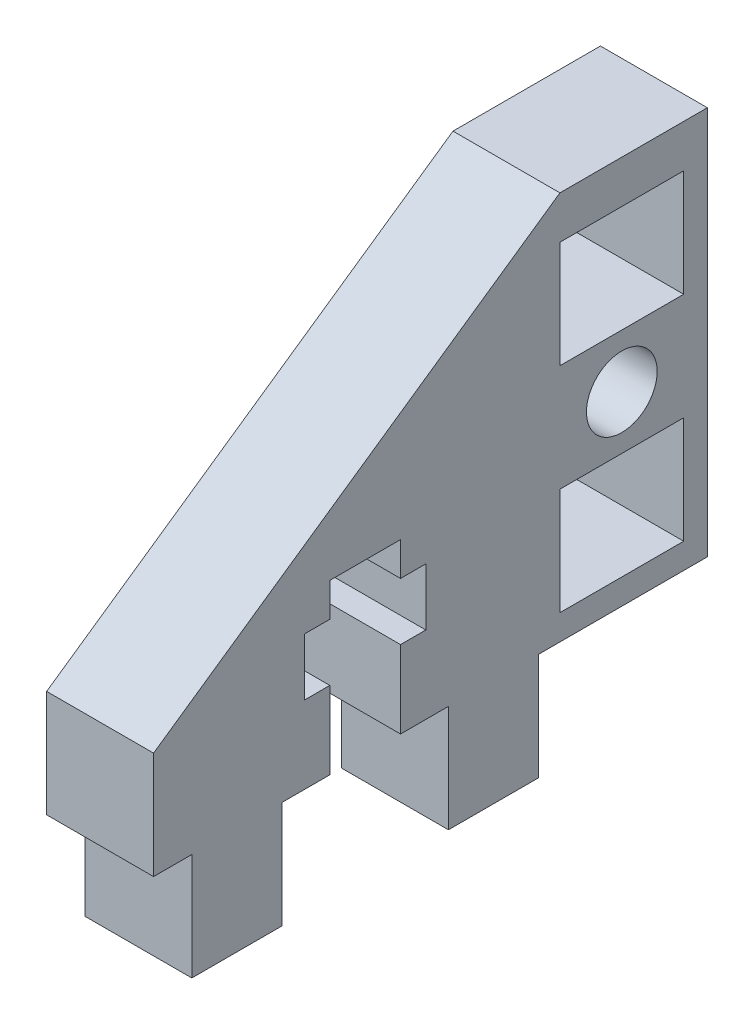
ISO-10303-21;
HEADER;
FILE_DESCRIPTION(('STEP AP214'),'2;1');
FILE_NAME('part.step','',(''),(''),'','','');
FILE_SCHEMA(('AUTOMOTIVE_DESIGN { 1 0 10303 214 1 1 1 1 }'));
ENDSEC;
DATA;
#1=APPLICATION_CONTEXT('core data for automotive mechanical design processes');
#2=APPLICATION_PROTOCOL_DEFINITION('international standard','automotive_design',2000,#1);
#3=PRODUCT_CONTEXT('',#1,'mechanical');
#4=PRODUCT('Part','Part','',(#3));
#5=PRODUCT_RELATED_PRODUCT_CATEGORY('part','',(#4));
#6=PRODUCT_DEFINITION_FORMATION('','',#4);
#7=PRODUCT_DEFINITION_CONTEXT('part definition',#1,'design');
#8=PRODUCT_DEFINITION('design','',#6,#7);
#9=PRODUCT_DEFINITION_SHAPE('','',#8);
#10=(LENGTH_UNIT() NAMED_UNIT(*) SI_UNIT(.MILLI.,.METRE.));
#11=(NAMED_UNIT(*) PLANE_ANGLE_UNIT() SI_UNIT($,.RADIAN.));
#12=(NAMED_UNIT(*) SI_UNIT($,.STERADIAN.) SOLID_ANGLE_UNIT());
#13=UNCERTAINTY_MEASURE_WITH_UNIT(LENGTH_MEASURE(1.E-05),#10,'distance_accuracy_value','');
#14=(GEOMETRIC_REPRESENTATION_CONTEXT(3) GLOBAL_UNCERTAINTY_ASSIGNED_CONTEXT((#13)) GLOBAL_UNIT_ASSIGNED_CONTEXT((#10,
#11,#12)) REPRESENTATION_CONTEXT('',''));
#15=CARTESIAN_POINT('',(0.,0.,0.));
#16=DIRECTION('',(0.,0.,1.));
#17=DIRECTION('',(1.,0.,0.));
#18=AXIS2_PLACEMENT_3D('',#15,#16,#17);
#19=CARTESIAN_POINT('',(265.43,16.5100000000001,77.895000039));
#20=DIRECTION('',(0.,0.,-1.));
#21=DIRECTION('',(-1.,0.,0.));
#22=AXIS2_PLACEMENT_3D('',#19,#20,#21);
#23=PLANE('',#22);
#24=DIRECTION('',(0.,1.,0.));
#25=VECTOR('',#24,1.);
#26=CARTESIAN_POINT('',(271.78,16.5100000000001,77.895000039));
#27=LINE('',#26,#25);
#28=CARTESIAN_POINT('',(271.78,16.5100000000001,77.895000039));
#29=VERTEX_POINT('',#28);
#30=CARTESIAN_POINT('',(271.78,22.8600000000001,77.895000039));
#31=VERTEX_POINT('',#30);
#32=EDGE_CURVE('E317',#29,#31,#27,.T.);
#33=ORIENTED_EDGE('',*,*,#32,.F.);
#34=DIRECTION('',(1.,0.,0.));
#35=VECTOR('',#34,1.);
#36=CARTESIAN_POINT('',(265.43,16.5100000000001,77.895000039));
#37=LINE('',#36,#35);
#38=CARTESIAN_POINT('',(265.43,16.5100000000001,77.895000039));
#39=VERTEX_POINT('',#38);
#40=EDGE_CURVE('E11',#39,#29,#37,.T.);
#41=ORIENTED_EDGE('',*,*,#40,.F.);
#42=DIRECTION('',(0.,1.,0.));
#43=VECTOR('',#42,1.);
#44=CARTESIAN_POINT('',(265.43,16.5100000000001,77.895000039));
#45=LINE('',#44,#43);
#46=CARTESIAN_POINT('',(265.43,22.8600000000001,77.895000039));
#47=VERTEX_POINT('',#46);
#48=EDGE_CURVE('E324',#39,#47,#45,.T.);
#49=ORIENTED_EDGE('',*,*,#48,.T.);
#50=DIRECTION('',(1.,0.,0.));
#51=VECTOR('',#50,1.);
#52=CARTESIAN_POINT('',(265.43,22.8600000000001,77.895000039));
#53=LINE('',#52,#51);
#54=EDGE_CURVE('E37',#47,#31,#53,.T.);
#55=ORIENTED_EDGE('',*,*,#54,.T.);
#56=EDGE_LOOP('',(#33,#41,#49,#55));
#57=FACE_BOUND('',#56,.T.);
#58=ADVANCED_FACE('F34',(#57),#23,.T.);
#59=CARTESIAN_POINT('',(265.43,16.5100000000001,77.895000039));
#60=DIRECTION('',(0.,-1.,0.));
#61=DIRECTION('',(0.,0.,-1.));
#62=AXIS2_PLACEMENT_3D('',#59,#60,#61);
#63=PLANE('',#62);
#64=DIRECTION('',(0.,0.,-1.));
#65=VECTOR('',#64,1.);
#66=CARTESIAN_POINT('',(271.78,16.5100000000001,77.895000039));
#67=LINE('',#66,#65);
#68=CARTESIAN_POINT('',(271.78,16.5100000000001,83.2450000070001));
#69=VERTEX_POINT('',#68);
#70=EDGE_CURVE('E328',#69,#29,#67,.T.);
#71=ORIENTED_EDGE('',*,*,#70,.F.);
#72=DIRECTION('',(1.,0.,0.));
#73=VECTOR('',#72,1.);
#74=CARTESIAN_POINT('',(265.43,16.5100000000001,83.2450000070001));
#75=LINE('',#74,#73);
#76=CARTESIAN_POINT('',(265.43,16.5100000000001,83.2450000070001));
#77=VERTEX_POINT('',#76);
#78=EDGE_CURVE('E42',#77,#69,#75,.T.);
#79=ORIENTED_EDGE('',*,*,#78,.F.);
#80=DIRECTION('',(0.,0.,-1.));
#81=VECTOR('',#80,1.);
#82=CARTESIAN_POINT('',(265.43,16.5100000000001,77.895000039));
#83=LINE('',#82,#81);
#84=EDGE_CURVE('E397',#77,#39,#83,.T.);
#85=ORIENTED_EDGE('',*,*,#84,.T.);
#86=ORIENTED_EDGE('',*,*,#40,.T.);
#87=EDGE_LOOP('',(#71,#79,#85,#86));
#88=FACE_BOUND('',#87,.T.);
#89=ADVANCED_FACE('F529',(#88),#63,.T.);
#90=CARTESIAN_POINT('',(265.43,22.8600000000001,83.2450000070001));
#91=DIRECTION('',(0.,0.,1.));
#92=DIRECTION('',(1.,0.,0.));
#93=AXIS2_PLACEMENT_3D('',#90,#91,#92);
#94=PLANE('',#93);
#95=DIRECTION('',(0.,-1.,0.));
#96=VECTOR('',#95,1.);
#97=CARTESIAN_POINT('',(271.78,22.8600000000001,83.2450000070001));
#98=LINE('',#97,#96);
#99=CARTESIAN_POINT('',(271.78,22.8600000000001,83.2450000070001));
#100=VERTEX_POINT('',#99);
#101=EDGE_CURVE('E468',#100,#69,#98,.T.);
#102=ORIENTED_EDGE('',*,*,#101,.F.);
#103=DIRECTION('',(1.,0.,0.));
#104=VECTOR('',#103,1.);
#105=CARTESIAN_POINT('',(265.43,22.8600000000001,83.2450000070001));
#106=LINE('',#105,#104);
#107=CARTESIAN_POINT('',(265.43,22.8600000000001,83.2450000070001));
#108=VERTEX_POINT('',#107);
#109=EDGE_CURVE('E474',#108,#100,#106,.T.);
#110=ORIENTED_EDGE('',*,*,#109,.F.);
#111=DIRECTION('',(0.,-1.,0.));
#112=VECTOR('',#111,1.);
#113=CARTESIAN_POINT('',(265.43,22.8600000000001,83.2450000070001));
#114=LINE('',#113,#112);
#115=EDGE_CURVE('E394',#108,#77,#114,.T.);
#116=ORIENTED_EDGE('',*,*,#115,.T.);
#117=ORIENTED_EDGE('',*,*,#78,.T.);
#118=EDGE_LOOP('',(#102,#110,#116,#117));
#119=FACE_BOUND('',#118,.T.);
#120=ADVANCED_FACE('F617',(#119),#94,.T.);
#121=CARTESIAN_POINT('',(265.43,22.8600000000001,86.090000032));
#122=DIRECTION('',(0.,-1.,0.));
#123=DIRECTION('',(0.,0.,-1.));
#124=AXIS2_PLACEMENT_3D('',#121,#122,#123);
#125=PLANE('',#124);
#126=DIRECTION('',(0.,0.,-1.));
#127=VECTOR('',#126,1.);
#128=CARTESIAN_POINT('',(271.78,22.8600000000001,86.090000032));
#129=LINE('',#128,#127);
#130=CARTESIAN_POINT('',(271.78,22.8600000000001,86.090000032));
#131=VERTEX_POINT('',#130);
#132=EDGE_CURVE('E465',#131,#100,#129,.T.);
#133=ORIENTED_EDGE('',*,*,#132,.F.);
#134=DIRECTION('',(1.,0.,0.));
#135=VECTOR('',#134,1.);
#136=CARTESIAN_POINT('',(265.43,22.8600000000001,86.090000032));
#137=LINE('',#136,#135);
#138=CARTESIAN_POINT('',(265.43,22.8600000000001,86.090000032));
#139=VERTEX_POINT('',#138);
#140=EDGE_CURVE('E476',#139,#131,#137,.T.);
#141=ORIENTED_EDGE('',*,*,#140,.F.);
#142=DIRECTION('',(0.,0.,-1.));
#143=VECTOR('',#142,1.);
#144=CARTESIAN_POINT('',(265.43,22.8600000000001,86.090000032));
#145=LINE('',#144,#143);
#146=EDGE_CURVE('E391',#139,#108,#145,.T.);
#147=ORIENTED_EDGE('',*,*,#146,.T.);
#148=ORIENTED_EDGE('',*,*,#109,.T.);
#149=EDGE_LOOP('',(#133,#141,#147,#148));
#150=FACE_BOUND('',#149,.T.);
#151=ADVANCED_FACE('F615',(#150),#125,.T.);
#152=CARTESIAN_POINT('',(265.43,22.8600000000001,86.090000032));
#153=DIRECTION('',(0.,0.,1.));
#154=DIRECTION('',(1.,0.,0.));
#155=AXIS2_PLACEMENT_3D('',#152,#153,#154);
#156=PLANE('',#155);
#157=DIRECTION('',(0.,-1.,0.));
#158=VECTOR('',#157,1.);
#159=CARTESIAN_POINT('',(271.78,22.8600000000001,86.090000032));
#160=LINE('',#159,#158);
#161=CARTESIAN_POINT('',(271.78,27.4599999440001,86.090000032));
#162=VERTEX_POINT('',#161);
#163=EDGE_CURVE('E462',#162,#131,#160,.T.);
#164=ORIENTED_EDGE('',*,*,#163,.F.);
#165=DIRECTION('',(1.,0.,0.));
#166=VECTOR('',#165,1.);
#167=CARTESIAN_POINT('',(265.43,27.4599999440001,86.090000032));
#168=LINE('',#167,#166);
#169=CARTESIAN_POINT('',(265.43,27.4599999440001,86.090000032));
#170=VERTEX_POINT('',#169);
#171=EDGE_CURVE('E478',#170,#162,#168,.T.);
#172=ORIENTED_EDGE('',*,*,#171,.F.);
#173=DIRECTION('',(0.,-1.,0.));
#174=VECTOR('',#173,1.);
#175=CARTESIAN_POINT('',(265.43,22.8600000000001,86.090000032));
#176=LINE('',#175,#174);
#177=EDGE_CURVE('E388',#170,#139,#176,.T.);
#178=ORIENTED_EDGE('',*,*,#177,.T.);
#179=ORIENTED_EDGE('',*,*,#140,.T.);
#180=EDGE_LOOP('',(#164,#172,#178,#179));
#181=FACE_BOUND('',#180,.T.);
#182=ADVANCED_FACE('F611',(#181),#156,.T.);
#183=CARTESIAN_POINT('',(265.43,27.4599999440001,86.090000032));
#184=DIRECTION('',(0.,1.,0.));
#185=DIRECTION('',(0.,0.,1.));
#186=AXIS2_PLACEMENT_3D('',#183,#184,#185);
#187=PLANE('',#186);
#188=DIRECTION('',(0.,0.,1.));
#189=VECTOR('',#188,1.);
#190=CARTESIAN_POINT('',(271.78,27.4599999440001,86.090000032));
#191=LINE('',#190,#189);
#192=CARTESIAN_POINT('',(271.78,27.4599999440001,84.589999984));
#193=VERTEX_POINT('',#192);
#194=EDGE_CURVE('E459',#193,#162,#191,.T.);
#195=ORIENTED_EDGE('',*,*,#194,.F.);
#196=DIRECTION('',(1.,0.,0.));
#197=VECTOR('',#196,1.);
#198=CARTESIAN_POINT('',(265.43,27.4599999440001,84.589999984));
#199=LINE('',#198,#197);
#200=CARTESIAN_POINT('',(265.43,27.4599999440001,84.589999984));
#201=VERTEX_POINT('',#200);
#202=EDGE_CURVE('E480',#201,#193,#199,.T.);
#203=ORIENTED_EDGE('',*,*,#202,.F.);
#204=DIRECTION('',(0.,0.,1.));
#205=VECTOR('',#204,1.);
#206=CARTESIAN_POINT('',(265.43,27.4599999440001,86.090000032));
#207=LINE('',#206,#205);
#208=EDGE_CURVE('E385',#201,#170,#207,.T.);
#209=ORIENTED_EDGE('',*,*,#208,.T.);
#210=ORIENTED_EDGE('',*,*,#171,.T.);
#211=EDGE_LOOP('',(#195,#203,#209,#210));
#212=FACE_BOUND('',#211,.T.);
#213=ADVANCED_FACE('F607',(#212),#187,.T.);
#214=CARTESIAN_POINT('',(265.43,27.4599999440001,84.589999984));
#215=DIRECTION('',(0.,0.,1.));
#216=DIRECTION('',(0.,-1.,0.));
#217=AXIS2_PLACEMENT_3D('',#214,#215,#216);
#218=PLANE('',#217);
#219=DIRECTION('',(0.,-1.,0.));
#220=VECTOR('',#219,1.);
#221=CARTESIAN_POINT('',(271.78,27.4599999440001,84.589999984));
#222=LINE('',#221,#220);
#223=CARTESIAN_POINT('',(271.78,30.8600000020001,84.589999984));
#224=VERTEX_POINT('',#223);
#225=EDGE_CURVE('E456',#224,#193,#222,.T.);
#226=ORIENTED_EDGE('',*,*,#225,.F.);
#227=DIRECTION('',(1.,0.,0.));
#228=VECTOR('',#227,1.);
#229=CARTESIAN_POINT('',(265.43,30.8600000020001,84.589999984));
#230=LINE('',#229,#228);
#231=CARTESIAN_POINT('',(265.43,30.8600000020001,84.589999984));
#232=VERTEX_POINT('',#231);
#233=EDGE_CURVE('E482',#232,#224,#230,.T.);
#234=ORIENTED_EDGE('',*,*,#233,.F.);
#235=DIRECTION('',(0.,-1.,0.));
#236=VECTOR('',#235,1.);
#237=CARTESIAN_POINT('',(265.43,27.4599999440001,84.589999984));
#238=LINE('',#237,#236);
#239=EDGE_CURVE('E382',#232,#201,#238,.T.);
#240=ORIENTED_EDGE('',*,*,#239,.T.);
#241=ORIENTED_EDGE('',*,*,#202,.T.);
#242=EDGE_LOOP('',(#226,#234,#240,#241));
#243=FACE_BOUND('',#242,.T.);
#244=ADVANCED_FACE('F603',(#243),#218,.T.);
#245=CARTESIAN_POINT('',(265.43,30.8600000020001,84.589999984));
#246=DIRECTION('',(0.,-1.,0.));
#247=DIRECTION('',(0.,0.,-1.));
#248=AXIS2_PLACEMENT_3D('',#245,#246,#247);
#249=PLANE('',#248);
#250=DIRECTION('',(0.,0.,-1.));
#251=VECTOR('',#250,1.);
#252=CARTESIAN_POINT('',(271.78,30.8600000020001,84.589999984));
#253=LINE('',#252,#251);
#254=CARTESIAN_POINT('',(271.78,30.8600000020001,86.090000032));
#255=VERTEX_POINT('',#254);
#256=EDGE_CURVE('E453',#255,#224,#253,.T.);
#257=ORIENTED_EDGE('',*,*,#256,.F.);
#258=DIRECTION('',(1.,0.,0.));
#259=VECTOR('',#258,1.);
#260=CARTESIAN_POINT('',(265.43,30.8600000020001,86.090000032));
#261=LINE('',#260,#259);
#262=CARTESIAN_POINT('',(265.43,30.8600000020001,86.090000032));
#263=VERTEX_POINT('',#262);
#264=EDGE_CURVE('E484',#263,#255,#261,.T.);
#265=ORIENTED_EDGE('',*,*,#264,.F.);
#266=DIRECTION('',(0.,0.,-1.));
#267=VECTOR('',#266,1.);
#268=CARTESIAN_POINT('',(265.43,30.8600000020001,84.589999984));
#269=LINE('',#268,#267);
#270=EDGE_CURVE('E379',#263,#232,#269,.T.);
#271=ORIENTED_EDGE('',*,*,#270,.T.);
#272=ORIENTED_EDGE('',*,*,#233,.T.);
#273=EDGE_LOOP('',(#257,#265,#271,#272));
#274=FACE_BOUND('',#273,.T.);
#275=ADVANCED_FACE('F599',(#274),#249,.T.);
#276=CARTESIAN_POINT('',(265.43,30.8600000020001,86.090000032));
#277=DIRECTION('',(0.,0.,1.));
#278=DIRECTION('',(1.,0.,0.));
#279=AXIS2_PLACEMENT_3D('',#276,#277,#278);
#280=PLANE('',#279);
#281=DIRECTION('',(0.,-1.,0.));
#282=VECTOR('',#281,1.);
#283=CARTESIAN_POINT('',(271.78,30.8600000020001,86.090000032));
#284=LINE('',#283,#282);
#285=CARTESIAN_POINT('',(271.78,32.8600000660001,86.090000032));
#286=VERTEX_POINT('',#285);
#287=EDGE_CURVE('E450',#286,#255,#284,.T.);
#288=ORIENTED_EDGE('',*,*,#287,.F.);
#289=DIRECTION('',(1.,0.,0.));
#290=VECTOR('',#289,1.);
#291=CARTESIAN_POINT('',(265.43,32.8600000660001,86.090000032));
#292=LINE('',#291,#290);
#293=CARTESIAN_POINT('',(265.43,32.8600000660001,86.090000032));
#294=VERTEX_POINT('',#293);
#295=EDGE_CURVE('E486',#294,#286,#292,.T.);
#296=ORIENTED_EDGE('',*,*,#295,.F.);
#297=DIRECTION('',(0.,-1.,0.));
#298=VECTOR('',#297,1.);
#299=CARTESIAN_POINT('',(265.43,30.8600000020001,86.090000032));
#300=LINE('',#299,#298);
#301=EDGE_CURVE('E376',#294,#263,#300,.T.);
#302=ORIENTED_EDGE('',*,*,#301,.T.);
#303=ORIENTED_EDGE('',*,*,#264,.T.);
#304=EDGE_LOOP('',(#288,#296,#302,#303));
#305=FACE_BOUND('',#304,.T.);
#306=ADVANCED_FACE('F595',(#305),#280,.T.);
#307=CARTESIAN_POINT('',(265.43,32.8600000660001,90.290000014));
#308=DIRECTION('',(0.,-1.,0.));
#309=DIRECTION('',(0.,0.,-1.));
#310=AXIS2_PLACEMENT_3D('',#307,#308,#309);
#311=PLANE('',#310);
#312=DIRECTION('',(0.,0.,-1.));
#313=VECTOR('',#312,1.);
#314=CARTESIAN_POINT('',(271.78,32.8600000660001,90.290000014));
#315=LINE('',#314,#313);
#316=CARTESIAN_POINT('',(271.78,32.8600000660001,90.290000014));
#317=VERTEX_POINT('',#316);
#318=EDGE_CURVE('E447',#317,#286,#315,.T.);
#319=ORIENTED_EDGE('',*,*,#318,.F.);
#320=DIRECTION('',(1.,0.,0.));
#321=VECTOR('',#320,1.);
#322=CARTESIAN_POINT('',(265.43,32.8600000660001,90.290000014));
#323=LINE('',#322,#321);
#324=CARTESIAN_POINT('',(265.43,32.8600000660001,90.290000014));
#325=VERTEX_POINT('',#324);
#326=EDGE_CURVE('E488',#325,#317,#323,.T.);
#327=ORIENTED_EDGE('',*,*,#326,.F.);
#328=DIRECTION('',(0.,0.,-1.));
#329=VECTOR('',#328,1.);
#330=CARTESIAN_POINT('',(265.43,32.8600000660001,90.290000014));
#331=LINE('',#330,#329);
#332=EDGE_CURVE('E373',#325,#294,#331,.T.);
#333=ORIENTED_EDGE('',*,*,#332,.T.);
#334=ORIENTED_EDGE('',*,*,#295,.T.);
#335=EDGE_LOOP('',(#319,#327,#333,#334));
#336=FACE_BOUND('',#335,.T.);
#337=ADVANCED_FACE('F591',(#336),#311,.T.);
#338=CARTESIAN_POINT('',(265.43,30.8600000020001,90.290000014));
#339=DIRECTION('',(0.,0.,-1.));
#340=DIRECTION('',(-1.,0.,0.));
#341=AXIS2_PLACEMENT_3D('',#338,#339,#340);
#342=PLANE('',#341);
#343=DIRECTION('',(0.,1.,0.));
#344=VECTOR('',#343,1.);
#345=CARTESIAN_POINT('',(271.78,30.8600000020001,90.290000014));
#346=LINE('',#345,#344);
#347=CARTESIAN_POINT('',(271.78,30.8600000020001,90.290000014));
#348=VERTEX_POINT('',#347);
#349=EDGE_CURVE('E444',#348,#317,#346,.T.);
#350=ORIENTED_EDGE('',*,*,#349,.F.);
#351=DIRECTION('',(1.,0.,0.));
#352=VECTOR('',#351,1.);
#353=CARTESIAN_POINT('',(265.43,30.8600000020001,90.290000014));
#354=LINE('',#353,#352);
#355=CARTESIAN_POINT('',(265.43,30.8600000020001,90.290000014));
#356=VERTEX_POINT('',#355);
#357=EDGE_CURVE('E490',#356,#348,#354,.T.);
#358=ORIENTED_EDGE('',*,*,#357,.F.);
#359=DIRECTION('',(0.,1.,0.));
#360=VECTOR('',#359,1.);
#361=CARTESIAN_POINT('',(265.43,30.8600000020001,90.290000014));
#362=LINE('',#361,#360);
#363=EDGE_CURVE('E370',#356,#325,#362,.T.);
#364=ORIENTED_EDGE('',*,*,#363,.T.);
#365=ORIENTED_EDGE('',*,*,#326,.T.);
#366=EDGE_LOOP('',(#350,#358,#364,#365));
#367=FACE_BOUND('',#366,.T.);
#368=ADVANCED_FACE('F587',(#367),#342,.T.);
#369=CARTESIAN_POINT('',(265.43,30.8600000020001,91.790000062));
#370=DIRECTION('',(0.,-1.,0.));
#371=DIRECTION('',(0.,0.,-1.));
#372=AXIS2_PLACEMENT_3D('',#369,#370,#371);
#373=PLANE('',#372);
#374=DIRECTION('',(0.,0.,-1.));
#375=VECTOR('',#374,1.);
#376=CARTESIAN_POINT('',(271.78,30.8600000020001,91.790000062));
#377=LINE('',#376,#375);
#378=CARTESIAN_POINT('',(271.78,30.8600000020001,91.790000062));
#379=VERTEX_POINT('',#378);
#380=EDGE_CURVE('E441',#379,#348,#377,.T.);
#381=ORIENTED_EDGE('',*,*,#380,.F.);
#382=DIRECTION('',(1.,0.,0.));
#383=VECTOR('',#382,1.);
#384=CARTESIAN_POINT('',(265.43,30.8600000020001,91.790000062));
#385=LINE('',#384,#383);
#386=CARTESIAN_POINT('',(265.43,30.8600000020001,91.790000062));
#387=VERTEX_POINT('',#386);
#388=EDGE_CURVE('E492',#387,#379,#385,.T.);
#389=ORIENTED_EDGE('',*,*,#388,.F.);
#390=DIRECTION('',(0.,0.,-1.));
#391=VECTOR('',#390,1.);
#392=CARTESIAN_POINT('',(265.43,30.8600000020001,91.790000062));
#393=LINE('',#392,#391);
#394=EDGE_CURVE('E367',#387,#356,#393,.T.);
#395=ORIENTED_EDGE('',*,*,#394,.T.);
#396=ORIENTED_EDGE('',*,*,#357,.T.);
#397=EDGE_LOOP('',(#381,#389,#395,#396));
#398=FACE_BOUND('',#397,.T.);
#399=ADVANCED_FACE('F583',(#398),#373,.T.);
#400=CARTESIAN_POINT('',(265.43,27.4599999440001,91.790000062));
#401=DIRECTION('',(0.,0.,-1.));
#402=DIRECTION('',(0.,1.,0.));
#403=AXIS2_PLACEMENT_3D('',#400,#401,#402);
#404=PLANE('',#403);
#405=DIRECTION('',(0.,1.,0.));
#406=VECTOR('',#405,1.);
#407=CARTESIAN_POINT('',(271.78,27.4599999440001,91.790000062));
#408=LINE('',#407,#406);
#409=CARTESIAN_POINT('',(271.78,27.4599999440001,91.790000062));
#410=VERTEX_POINT('',#409);
#411=EDGE_CURVE('E438',#410,#379,#408,.T.);
#412=ORIENTED_EDGE('',*,*,#411,.F.);
#413=DIRECTION('',(1.,0.,0.));
#414=VECTOR('',#413,1.);
#415=CARTESIAN_POINT('',(265.43,27.4599999440001,91.790000062));
#416=LINE('',#415,#414);
#417=CARTESIAN_POINT('',(265.43,27.4599999440001,91.790000062));
#418=VERTEX_POINT('',#417);
#419=EDGE_CURVE('E494',#418,#410,#416,.T.);
#420=ORIENTED_EDGE('',*,*,#419,.F.);
#421=DIRECTION('',(0.,1.,0.));
#422=VECTOR('',#421,1.);
#423=CARTESIAN_POINT('',(265.43,27.4599999440001,91.790000062));
#424=LINE('',#423,#422);
#425=EDGE_CURVE('E364',#418,#387,#424,.T.);
#426=ORIENTED_EDGE('',*,*,#425,.T.);
#427=ORIENTED_EDGE('',*,*,#388,.T.);
#428=EDGE_LOOP('',(#412,#420,#426,#427));
#429=FACE_BOUND('',#428,.T.);
#430=ADVANCED_FACE('F579',(#429),#404,.T.);
#431=CARTESIAN_POINT('',(265.43,27.4599999440001,90.290000014));
#432=DIRECTION('',(0.,1.,0.));
#433=DIRECTION('',(0.,0.,1.));
#434=AXIS2_PLACEMENT_3D('',#431,#432,#433);
#435=PLANE('',#434);
#436=DIRECTION('',(0.,0.,1.));
#437=VECTOR('',#436,1.);
#438=CARTESIAN_POINT('',(271.78,27.4599999440001,90.290000014));
#439=LINE('',#438,#437);
#440=CARTESIAN_POINT('',(271.78,27.4599999440001,90.290000014));
#441=VERTEX_POINT('',#440);
#442=EDGE_CURVE('E435',#441,#410,#439,.T.);
#443=ORIENTED_EDGE('',*,*,#442,.F.);
#444=DIRECTION('',(1.,0.,0.));
#445=VECTOR('',#444,1.);
#446=CARTESIAN_POINT('',(265.43,27.4599999440001,90.290000014));
#447=LINE('',#446,#445);
#448=CARTESIAN_POINT('',(265.43,27.4599999440001,90.290000014));
#449=VERTEX_POINT('',#448);
#450=EDGE_CURVE('E496',#449,#441,#447,.T.);
#451=ORIENTED_EDGE('',*,*,#450,.F.);
#452=DIRECTION('',(0.,0.,1.));
#453=VECTOR('',#452,1.);
#454=CARTESIAN_POINT('',(265.43,27.4599999440001,90.290000014));
#455=LINE('',#454,#453);
#456=EDGE_CURVE('E361',#449,#418,#455,.T.);
#457=ORIENTED_EDGE('',*,*,#456,.T.);
#458=ORIENTED_EDGE('',*,*,#419,.T.);
#459=EDGE_LOOP('',(#443,#451,#457,#458));
#460=FACE_BOUND('',#459,.T.);
#461=ADVANCED_FACE('F575',(#460),#435,.T.);
#462=CARTESIAN_POINT('',(265.43,22.8600000000001,90.290000014));
#463=DIRECTION('',(0.,0.,-1.));
#464=DIRECTION('',(-1.,0.,0.));
#465=AXIS2_PLACEMENT_3D('',#462,#463,#464);
#466=PLANE('',#465);
#467=DIRECTION('',(0.,1.,0.));
#468=VECTOR('',#467,1.);
#469=CARTESIAN_POINT('',(271.78,22.8600000000001,90.290000014));
#470=LINE('',#469,#468);
#471=CARTESIAN_POINT('',(271.78,22.8600000000001,90.290000014));
#472=VERTEX_POINT('',#471);
#473=EDGE_CURVE('E432',#472,#441,#470,.T.);
#474=ORIENTED_EDGE('',*,*,#473,.F.);
#475=DIRECTION('',(1.,0.,0.));
#476=VECTOR('',#475,1.);
#477=CARTESIAN_POINT('',(265.43,22.8600000000001,90.290000014));
#478=LINE('',#477,#476);
#479=CARTESIAN_POINT('',(265.43,22.8600000000001,90.290000014));
#480=VERTEX_POINT('',#479);
#481=EDGE_CURVE('E498',#480,#472,#478,.T.);
#482=ORIENTED_EDGE('',*,*,#481,.F.);
#483=DIRECTION('',(0.,1.,0.));
#484=VECTOR('',#483,1.);
#485=CARTESIAN_POINT('',(265.43,22.8600000000001,90.290000014));
#486=LINE('',#485,#484);
#487=EDGE_CURVE('E358',#480,#449,#486,.T.);
#488=ORIENTED_EDGE('',*,*,#487,.T.);
#489=ORIENTED_EDGE('',*,*,#450,.T.);
#490=EDGE_LOOP('',(#474,#482,#488,#489));
#491=FACE_BOUND('',#490,.T.);
#492=ADVANCED_FACE('F571',(#491),#466,.T.);
#493=CARTESIAN_POINT('',(265.43,22.8600000000001,93.135000039));
#494=DIRECTION('',(0.,-1.,0.));
#495=DIRECTION('',(0.,0.,-1.));
#496=AXIS2_PLACEMENT_3D('',#493,#494,#495);
#497=PLANE('',#496);
#498=DIRECTION('',(0.,0.,-1.));
#499=VECTOR('',#498,1.);
#500=CARTESIAN_POINT('',(271.78,22.8600000000001,93.135000039));
#501=LINE('',#500,#499);
#502=CARTESIAN_POINT('',(271.78,22.8600000000001,93.135000039));
#503=VERTEX_POINT('',#502);
#504=EDGE_CURVE('E429',#503,#472,#501,.T.);
#505=ORIENTED_EDGE('',*,*,#504,.F.);
#506=DIRECTION('',(1.,0.,0.));
#507=VECTOR('',#506,1.);
#508=CARTESIAN_POINT('',(265.43,22.8600000000001,93.135000039));
#509=LINE('',#508,#507);
#510=CARTESIAN_POINT('',(265.43,22.8600000000001,93.135000039));
#511=VERTEX_POINT('',#510);
#512=EDGE_CURVE('E500',#511,#503,#509,.T.);
#513=ORIENTED_EDGE('',*,*,#512,.F.);
#514=DIRECTION('',(0.,0.,-1.));
#515=VECTOR('',#514,1.);
#516=CARTESIAN_POINT('',(265.43,22.8600000000001,93.135000039));
#517=LINE('',#516,#515);
#518=EDGE_CURVE('E355',#511,#480,#517,.T.);
#519=ORIENTED_EDGE('',*,*,#518,.T.);
#520=ORIENTED_EDGE('',*,*,#481,.T.);
#521=EDGE_LOOP('',(#505,#513,#519,#520));
#522=FACE_BOUND('',#521,.T.);
#523=ADVANCED_FACE('F567',(#522),#497,.T.);
#524=CARTESIAN_POINT('',(265.43,16.5100000000001,93.135000039));
#525=DIRECTION('',(0.,0.,-1.));
#526=DIRECTION('',(-1.,0.,0.));
#527=AXIS2_PLACEMENT_3D('',#524,#525,#526);
#528=PLANE('',#527);
#529=DIRECTION('',(0.,1.,0.));
#530=VECTOR('',#529,1.);
#531=CARTESIAN_POINT('',(271.78,16.5100000000001,93.135000039));
#532=LINE('',#531,#530);
#533=CARTESIAN_POINT('',(271.78,16.5100000000001,93.135000039));
#534=VERTEX_POINT('',#533);
#535=EDGE_CURVE('E426',#534,#503,#532,.T.);
#536=ORIENTED_EDGE('',*,*,#535,.F.);
#537=DIRECTION('',(1.,0.,0.));
#538=VECTOR('',#537,1.);
#539=CARTESIAN_POINT('',(265.43,16.5100000000001,93.135000039));
#540=LINE('',#539,#538);
#541=CARTESIAN_POINT('',(265.43,16.5100000000001,93.135000039));
#542=VERTEX_POINT('',#541);
#543=EDGE_CURVE('E502',#542,#534,#540,.T.);
#544=ORIENTED_EDGE('',*,*,#543,.F.);
#545=DIRECTION('',(0.,1.,0.));
#546=VECTOR('',#545,1.);
#547=CARTESIAN_POINT('',(265.43,16.5100000000001,93.135000039));
#548=LINE('',#547,#546);
#549=EDGE_CURVE('E352',#542,#511,#548,.T.);
#550=ORIENTED_EDGE('',*,*,#549,.T.);
#551=ORIENTED_EDGE('',*,*,#512,.T.);
#552=EDGE_LOOP('',(#536,#544,#550,#551));
#553=FACE_BOUND('',#552,.T.);
#554=ADVANCED_FACE('F563',(#553),#528,.T.);
#555=CARTESIAN_POINT('',(265.43,16.5100000000001,93.135000039));
#556=DIRECTION('',(0.,-1.,0.));
#557=DIRECTION('',(0.,0.,-1.));
#558=AXIS2_PLACEMENT_3D('',#555,#556,#557);
#559=PLANE('',#558);
#560=DIRECTION('',(0.,0.,-1.));
#561=VECTOR('',#560,1.);
#562=CARTESIAN_POINT('',(271.78,16.5100000000001,93.135000039));
#563=LINE('',#562,#561);
#564=CARTESIAN_POINT('',(271.78,16.5100000000001,98.485000007));
#565=VERTEX_POINT('',#564);
#566=EDGE_CURVE('E423',#565,#534,#563,.T.);
#567=ORIENTED_EDGE('',*,*,#566,.F.);
#568=DIRECTION('',(1.,0.,0.));
#569=VECTOR('',#568,1.);
#570=CARTESIAN_POINT('',(265.43,16.5100000000001,98.485000007));
#571=LINE('',#570,#569);
#572=CARTESIAN_POINT('',(265.43,16.5100000000001,98.485000007));
#573=VERTEX_POINT('',#572);
#574=EDGE_CURVE('E504',#573,#565,#571,.T.);
#575=ORIENTED_EDGE('',*,*,#574,.F.);
#576=DIRECTION('',(0.,0.,-1.));
#577=VECTOR('',#576,1.);
#578=CARTESIAN_POINT('',(265.43,16.5100000000001,93.135000039));
#579=LINE('',#578,#577);
#580=EDGE_CURVE('E349',#573,#542,#579,.T.);
#581=ORIENTED_EDGE('',*,*,#580,.T.);
#582=ORIENTED_EDGE('',*,*,#543,.T.);
#583=EDGE_LOOP('',(#567,#575,#581,#582));
#584=FACE_BOUND('',#583,.T.);
#585=ADVANCED_FACE('F559',(#584),#559,.T.);
#586=CARTESIAN_POINT('',(265.43,16.5100000000001,98.485000007));
#587=DIRECTION('',(0.,0.,1.));
#588=DIRECTION('',(1.,0.,0.));
#589=AXIS2_PLACEMENT_3D('',#586,#587,#588);
#590=PLANE('',#589);
#591=DIRECTION('',(0.,-1.,0.));
#592=VECTOR('',#591,1.);
#593=CARTESIAN_POINT('',(271.78,16.5100000000001,98.485000007));
#594=LINE('',#593,#592);
#595=CARTESIAN_POINT('',(271.78,22.8600000000001,98.485000007));
#596=VERTEX_POINT('',#595);
#597=EDGE_CURVE('E420',#596,#565,#594,.T.);
#598=ORIENTED_EDGE('',*,*,#597,.F.);
#599=DIRECTION('',(1.,0.,0.));
#600=VECTOR('',#599,1.);
#601=CARTESIAN_POINT('',(265.43,22.8600000000001,98.485000007));
#602=LINE('',#601,#600);
#603=CARTESIAN_POINT('',(265.43,22.8600000000001,98.485000007));
#604=VERTEX_POINT('',#603);
#605=EDGE_CURVE('E506',#604,#596,#602,.T.);
#606=ORIENTED_EDGE('',*,*,#605,.F.);
#607=DIRECTION('',(0.,-1.,0.));
#608=VECTOR('',#607,1.);
#609=CARTESIAN_POINT('',(265.43,16.5100000000001,98.485000007));
#610=LINE('',#609,#608);
#611=EDGE_CURVE('E346',#604,#573,#610,.T.);
#612=ORIENTED_EDGE('',*,*,#611,.T.);
#613=ORIENTED_EDGE('',*,*,#574,.T.);
#614=EDGE_LOOP('',(#598,#606,#612,#613));
#615=FACE_BOUND('',#614,.T.);
#616=ADVANCED_FACE('F555',(#615),#590,.T.);
#617=CARTESIAN_POINT('',(265.43,22.8600000000001,98.485000007));
#618=DIRECTION('',(0.,-1.,0.));
#619=DIRECTION('',(0.,0.,-1.));
#620=AXIS2_PLACEMENT_3D('',#617,#618,#619);
#621=PLANE('',#620);
#622=DIRECTION('',(0.,0.,-1.));
#623=VECTOR('',#622,1.);
#624=CARTESIAN_POINT('',(271.78,22.8600000000001,98.485000007));
#625=LINE('',#624,#623);
#626=CARTESIAN_POINT('',(271.78,22.8600000000002,100.755000039));
#627=VERTEX_POINT('',#626);
#628=EDGE_CURVE('E417',#627,#596,#625,.T.);
#629=ORIENTED_EDGE('',*,*,#628,.F.);
#630=DIRECTION('',(1.,0.,0.));
#631=VECTOR('',#630,1.);
#632=CARTESIAN_POINT('',(265.43,22.8600000000002,100.755000039));
#633=LINE('',#632,#631);
#634=CARTESIAN_POINT('',(265.43,22.8600000000002,100.755000039));
#635=VERTEX_POINT('',#634);
#636=EDGE_CURVE('E508',#635,#627,#633,.T.);
#637=ORIENTED_EDGE('',*,*,#636,.F.);
#638=DIRECTION('',(0.,0.,-1.));
#639=VECTOR('',#638,1.);
#640=CARTESIAN_POINT('',(265.43,22.8600000000001,98.485000007));
#641=LINE('',#640,#639);
#642=EDGE_CURVE('E343',#635,#604,#641,.T.);
#643=ORIENTED_EDGE('',*,*,#642,.T.);
#644=ORIENTED_EDGE('',*,*,#605,.T.);
#645=EDGE_LOOP('',(#629,#637,#643,#644));
#646=FACE_BOUND('',#645,.T.);
#647=ADVANCED_FACE('F551',(#646),#621,.T.);
#648=CARTESIAN_POINT('',(265.43,29.2100000000002,100.755000039));
#649=DIRECTION('',(0.,0.,1.));
#650=DIRECTION('',(1.,0.,0.));
#651=AXIS2_PLACEMENT_3D('',#648,#649,#650);
#652=PLANE('',#651);
#653=DIRECTION('',(0.,-1.,0.));
#654=VECTOR('',#653,1.);
#655=CARTESIAN_POINT('',(271.78,29.2100000000002,100.755000039));
#656=LINE('',#655,#654);
#657=CARTESIAN_POINT('',(271.78,29.2100000000002,100.755000039));
#658=VERTEX_POINT('',#657);
#659=EDGE_CURVE('E414',#658,#627,#656,.T.);
#660=ORIENTED_EDGE('',*,*,#659,.F.);
#661=DIRECTION('',(1.,0.,0.));
#662=VECTOR('',#661,1.);
#663=CARTESIAN_POINT('',(265.43,29.2100000000002,100.755000039));
#664=LINE('',#663,#662);
#665=CARTESIAN_POINT('',(265.43,29.2100000000002,100.755000039));
#666=VERTEX_POINT('',#665);
#667=EDGE_CURVE('E510',#666,#658,#664,.T.);
#668=ORIENTED_EDGE('',*,*,#667,.F.);
#669=DIRECTION('',(0.,-1.,0.));
#670=VECTOR('',#669,1.);
#671=CARTESIAN_POINT('',(265.43,29.2100000000002,100.755000039));
#672=LINE('',#671,#670);
#673=EDGE_CURVE('E340',#666,#635,#672,.T.);
#674=ORIENTED_EDGE('',*,*,#673,.T.);
#675=ORIENTED_EDGE('',*,*,#636,.T.);
#676=EDGE_LOOP('',(#660,#668,#674,#675));
#677=FACE_BOUND('',#676,.T.);
#678=ADVANCED_FACE('F547',(#677),#652,.T.);
#679=CARTESIAN_POINT('',(265.43,45.9580000320001,76.6250000390001));
#680=DIRECTION('',(0.,0.82151260709376,0.57019035101097));
#681=DIRECTION('',(0.,-0.57019035101097,0.82151260709376));
#682=AXIS2_PLACEMENT_3D('',#679,#680,#681);
#683=PLANE('',#682);
#684=DIRECTION('',(0.,-0.57019035101097,0.82151260709376));
#685=VECTOR('',#684,1.);
#686=CARTESIAN_POINT('',(271.78,45.9580000320001,76.6250000390001));
#687=LINE('',#686,#685);
#688=CARTESIAN_POINT('',(271.78,45.9580000320001,76.6250000390001));
#689=VERTEX_POINT('',#688);
#690=EDGE_CURVE('E411',#689,#658,#687,.T.);
#691=ORIENTED_EDGE('',*,*,#690,.F.);
#692=DIRECTION('',(1.,0.,0.));
#693=VECTOR('',#692,1.);
#694=CARTESIAN_POINT('',(265.43,45.9580000320001,76.6250000390001));
#695=LINE('',#694,#693);
#696=CARTESIAN_POINT('',(265.43,45.9580000320001,76.6250000390001));
#697=VERTEX_POINT('',#696);
#698=EDGE_CURVE('E512',#697,#689,#695,.T.);
#699=ORIENTED_EDGE('',*,*,#698,.F.);
#700=DIRECTION('',(0.,-0.57019035101097,0.82151260709376));
#701=VECTOR('',#700,1.);
#702=CARTESIAN_POINT('',(265.43,45.9580000320001,76.6250000390001));
#703=LINE('',#702,#701);
#704=EDGE_CURVE('E337',#697,#666,#703,.T.);
#705=ORIENTED_EDGE('',*,*,#704,.T.);
#706=ORIENTED_EDGE('',*,*,#667,.T.);
#707=EDGE_LOOP('',(#691,#699,#705,#706));
#708=FACE_BOUND('',#707,.T.);
#709=ADVANCED_FACE('F543',(#708),#683,.T.);
#710=CARTESIAN_POINT('',(265.43,45.9580000320001,76.6250000390001));
#711=DIRECTION('',(0.,1.,0.));
#712=DIRECTION('',(0.,0.,1.));
#713=AXIS2_PLACEMENT_3D('',#710,#711,#712);
#714=PLANE('',#713);
#715=DIRECTION('',(0.,0.,1.));
#716=VECTOR('',#715,1.);
#717=CARTESIAN_POINT('',(271.78,45.9580000320001,76.6250000390001));
#718=LINE('',#717,#716);
#719=CARTESIAN_POINT('',(271.78,45.9580000320001,67.8700000230001));
#720=VERTEX_POINT('',#719);
#721=EDGE_CURVE('E408',#720,#689,#718,.T.);
#722=ORIENTED_EDGE('',*,*,#721,.F.);
#723=DIRECTION('',(1.,0.,0.));
#724=VECTOR('',#723,1.);
#725=CARTESIAN_POINT('',(265.43,45.9580000320001,67.8700000230001));
#726=LINE('',#725,#724);
#727=CARTESIAN_POINT('',(265.43,45.9580000320001,67.8700000230001));
#728=VERTEX_POINT('',#727);
#729=EDGE_CURVE('E514',#728,#720,#726,.T.);
#730=ORIENTED_EDGE('',*,*,#729,.F.);
#731=DIRECTION('',(0.,0.,1.));
#732=VECTOR('',#731,1.);
#733=CARTESIAN_POINT('',(265.43,45.9580000320001,76.6250000390001));
#734=LINE('',#733,#732);
#735=EDGE_CURVE('E334',#728,#697,#734,.T.);
#736=ORIENTED_EDGE('',*,*,#735,.T.);
#737=ORIENTED_EDGE('',*,*,#698,.T.);
#738=EDGE_LOOP('',(#722,#730,#736,#737));
#739=FACE_BOUND('',#738,.T.);
#740=ADVANCED_FACE('F541',(#739),#714,.T.);
#741=CARTESIAN_POINT('',(265.43,22.8600000000001,67.8700000230001));
#742=DIRECTION('',(0.,0.,-1.));
#743=DIRECTION('',(-1.,0.,0.));
#744=AXIS2_PLACEMENT_3D('',#741,#742,#743);
#745=PLANE('',#744);
#746=DIRECTION('',(0.,1.,0.));
#747=VECTOR('',#746,1.);
#748=CARTESIAN_POINT('',(271.78,22.8600000000001,67.8700000230001));
#749=LINE('',#748,#747);
#750=CARTESIAN_POINT('',(271.78,22.8600000000001,67.8700000230001));
#751=VERTEX_POINT('',#750);
#752=EDGE_CURVE('E405',#751,#720,#749,.T.);
#753=ORIENTED_EDGE('',*,*,#752,.F.);
#754=DIRECTION('',(1.,0.,0.));
#755=VECTOR('',#754,1.);
#756=CARTESIAN_POINT('',(265.43,22.8600000000001,67.8700000230001));
#757=LINE('',#756,#755);
#758=CARTESIAN_POINT('',(265.43,22.8600000000001,67.8700000230001));
#759=VERTEX_POINT('',#758);
#760=EDGE_CURVE('E515',#759,#751,#757,.T.);
#761=ORIENTED_EDGE('',*,*,#760,.F.);
#762=DIRECTION('',(0.,1.,0.));
#763=VECTOR('',#762,1.);
#764=CARTESIAN_POINT('',(265.43,22.8600000000001,67.8700000230001));
#765=LINE('',#764,#763);
#766=EDGE_CURVE('E331',#759,#728,#765,.T.);
#767=ORIENTED_EDGE('',*,*,#766,.T.);
#768=ORIENTED_EDGE('',*,*,#729,.T.);
#769=EDGE_LOOP('',(#753,#761,#767,#768));
#770=FACE_BOUND('',#769,.T.);
#771=ADVANCED_FACE('F537',(#770),#745,.T.);
#772=CARTESIAN_POINT('',(265.43,22.8600000000001,77.895000039));
#773=DIRECTION('',(0.,-1.,0.));
#774=DIRECTION('',(0.,0.,-1.));
#775=AXIS2_PLACEMENT_3D('',#772,#773,#774);
#776=PLANE('',#775);
#777=DIRECTION('',(0.,0.,-1.));
#778=VECTOR('',#777,1.);
#779=CARTESIAN_POINT('',(271.78,22.8600000000001,77.895000039));
#780=LINE('',#779,#778);
#781=EDGE_CURVE('E402',#31,#751,#780,.T.);
#782=ORIENTED_EDGE('',*,*,#781,.F.);
#783=ORIENTED_EDGE('',*,*,#54,.F.);
#784=DIRECTION('',(0.,0.,-1.));
#785=VECTOR('',#784,1.);
#786=CARTESIAN_POINT('',(265.43,22.8600000000001,77.895000039));
#787=LINE('',#786,#785);
#788=EDGE_CURVE('E327',#47,#759,#787,.T.);
#789=ORIENTED_EDGE('',*,*,#788,.T.);
#790=ORIENTED_EDGE('',*,*,#760,.T.);
#791=EDGE_LOOP('',(#782,#783,#789,#790));
#792=FACE_BOUND('',#791,.T.);
#793=ADVANCED_FACE('F523',(#792),#776,.T.);
#794=CARTESIAN_POINT('',(265.43,0.,0.));
#795=DIRECTION('',(-1.,0.,0.));
#796=DIRECTION('',(0.,0.,1.));
#797=AXIS2_PLACEMENT_3D('',#794,#795,#796);
#798=PLANE('',#797);
#799=DIRECTION('',(0.,1.,0.));
#800=VECTOR('',#799,1.);
#801=CARTESIAN_POINT('',(265.43,24.3680000320001,69.2750000070001));
#802=LINE('',#801,#800);
#803=CARTESIAN_POINT('',(265.43,24.3680000320001,69.2750000070001));
#804=VERTEX_POINT('',#803);
#805=CARTESIAN_POINT('',(265.43,30.7180000320001,69.2750000070001));
#806=VERTEX_POINT('',#805);
#807=EDGE_CURVE('E251',#804,#806,#802,.T.);
#808=ORIENTED_EDGE('',*,*,#807,.T.);
#809=DIRECTION('',(0.,0.,1.));
#810=VECTOR('',#809,1.);
#811=CARTESIAN_POINT('',(265.43,30.7180000320001,69.2750000070001));
#812=LINE('',#811,#810);
#813=CARTESIAN_POINT('',(265.43,30.7180000320001,76.6250000390001));
#814=VERTEX_POINT('',#813);
#815=EDGE_CURVE('E260',#806,#814,#812,.T.);
#816=ORIENTED_EDGE('',*,*,#815,.T.);
#817=DIRECTION('',(0.,-1.,0.));
#818=VECTOR('',#817,1.);
#819=CARTESIAN_POINT('',(265.43,24.3680000320001,76.6250000390001));
#820=LINE('',#819,#818);
#821=CARTESIAN_POINT('',(265.43,24.3680000320001,76.6250000390001));
#822=VERTEX_POINT('',#821);
#823=EDGE_CURVE('E50',#814,#822,#820,.T.);
#824=ORIENTED_EDGE('',*,*,#823,.T.);
#825=DIRECTION('',(0.,0.,-1.));
#826=VECTOR('',#825,1.);
#827=CARTESIAN_POINT('',(265.43,24.3680000320001,69.2750000070001));
#828=LINE('',#827,#826);
#829=EDGE_CURVE('E257',#822,#804,#828,.T.);
#830=ORIENTED_EDGE('',*,*,#829,.T.);
#831=EDGE_LOOP('',(#808,#816,#824,#830));
#832=FACE_BOUND('',#831,.T.);
#833=CARTESIAN_POINT('',(265.43,33.8930000320001,72.9500000230001));
#834=DIRECTION('',(1.,0.,0.));
#835=DIRECTION('',(0.,0.,-1.));
#836=AXIS2_PLACEMENT_3D('',#833,#834,#835);
#837=CIRCLE('',#836,2.09999999099998);
#838=CARTESIAN_POINT('',(265.43,33.8930000320001,70.8500000320001));
#839=VERTEX_POINT('',#838);
#840=EDGE_CURVE('E286',#839,#839,#837,.T.);
#841=ORIENTED_EDGE('',*,*,#840,.T.);
#842=EDGE_LOOP('',(#841));
#843=FACE_BOUND('',#842,.T.);
#844=DIRECTION('',(0.,-1.,0.));
#845=VECTOR('',#844,1.);
#846=CARTESIAN_POINT('',(265.43,43.4180000320001,76.6250000390001));
#847=LINE('',#846,#845);
#848=CARTESIAN_POINT('',(265.43,43.4180000320001,76.6250000390001));
#849=VERTEX_POINT('',#848);
#850=CARTESIAN_POINT('',(265.43,37.0680000320001,76.6250000390001));
#851=VERTEX_POINT('',#850);
#852=EDGE_CURVE('E292',#849,#851,#847,.T.);
#853=ORIENTED_EDGE('',*,*,#852,.T.);
#854=DIRECTION('',(0.,0.,-1.));
#855=VECTOR('',#854,1.);
#856=CARTESIAN_POINT('',(265.43,37.0680000320001,69.2750000070001));
#857=LINE('',#856,#855);
#858=CARTESIAN_POINT('',(265.43,37.0680000320001,69.2750000070001));
#859=VERTEX_POINT('',#858);
#860=EDGE_CURVE('E295',#851,#859,#857,.T.);
#861=ORIENTED_EDGE('',*,*,#860,.T.);
#862=DIRECTION('',(0.,1.,0.));
#863=VECTOR('',#862,1.);
#864=CARTESIAN_POINT('',(265.43,43.4180000320001,69.2750000070001));
#865=LINE('',#864,#863);
#866=CARTESIAN_POINT('',(265.43,43.4180000320001,69.2750000070001));
#867=VERTEX_POINT('',#866);
#868=EDGE_CURVE('E299',#859,#867,#865,.T.);
#869=ORIENTED_EDGE('',*,*,#868,.T.);
#870=DIRECTION('',(0.,0.,1.));
#871=VECTOR('',#870,1.);
#872=CARTESIAN_POINT('',(265.43,43.4180000320001,69.2750000070001));
#873=LINE('',#872,#871);
#874=EDGE_CURVE('E302',#867,#849,#873,.T.);
#875=ORIENTED_EDGE('',*,*,#874,.T.);
#876=EDGE_LOOP('',(#853,#861,#869,#875));
#877=FACE_BOUND('',#876,.T.);
#878=ORIENTED_EDGE('',*,*,#48,.F.);
#879=ORIENTED_EDGE('',*,*,#84,.F.);
#880=ORIENTED_EDGE('',*,*,#115,.F.);
#881=ORIENTED_EDGE('',*,*,#146,.F.);
#882=ORIENTED_EDGE('',*,*,#177,.F.);
#883=ORIENTED_EDGE('',*,*,#208,.F.);
#884=ORIENTED_EDGE('',*,*,#239,.F.);
#885=ORIENTED_EDGE('',*,*,#270,.F.);
#886=ORIENTED_EDGE('',*,*,#301,.F.);
#887=ORIENTED_EDGE('',*,*,#332,.F.);
#888=ORIENTED_EDGE('',*,*,#363,.F.);
#889=ORIENTED_EDGE('',*,*,#394,.F.);
#890=ORIENTED_EDGE('',*,*,#425,.F.);
#891=ORIENTED_EDGE('',*,*,#456,.F.);
#892=ORIENTED_EDGE('',*,*,#487,.F.);
#893=ORIENTED_EDGE('',*,*,#518,.F.);
#894=ORIENTED_EDGE('',*,*,#549,.F.);
#895=ORIENTED_EDGE('',*,*,#580,.F.);
#896=ORIENTED_EDGE('',*,*,#611,.F.);
#897=ORIENTED_EDGE('',*,*,#642,.F.);
#898=ORIENTED_EDGE('',*,*,#673,.F.);
#899=ORIENTED_EDGE('',*,*,#704,.F.);
#900=ORIENTED_EDGE('',*,*,#735,.F.);
#901=ORIENTED_EDGE('',*,*,#766,.F.);
#902=ORIENTED_EDGE('',*,*,#788,.F.);
#903=EDGE_LOOP('',(#878,#879,#880,#881,#882,#883,#884,#885,#886,#887,#888,#889,#890,#891,#892,
#893,#894,#895,#896,#897,#898,#899,#900,#901,#902));
#904=FACE_BOUND('',#903,.T.);
#905=ADVANCED_FACE('F264',(#832,#843,#877,#904),#798,.T.);
#906=CARTESIAN_POINT('',(271.78,0.,0.));
#907=DIRECTION('',(-1.,0.,0.));
#908=DIRECTION('',(0.,0.,1.));
#909=AXIS2_PLACEMENT_3D('',#906,#907,#908);
#910=PLANE('',#909);
#911=DIRECTION('',(0.,0.,1.));
#912=VECTOR('',#911,1.);
#913=CARTESIAN_POINT('',(271.78,30.7180000320001,69.2750000070001));
#914=LINE('',#913,#912);
#915=CARTESIAN_POINT('',(271.78,30.7180000320001,69.2750000070001));
#916=VERTEX_POINT('',#915);
#917=CARTESIAN_POINT('',(271.78,30.7180000320001,76.6250000390001));
#918=VERTEX_POINT('',#917);
#919=EDGE_CURVE('E276',#916,#918,#914,.T.);
#920=ORIENTED_EDGE('',*,*,#919,.F.);
#921=DIRECTION('',(0.,1.,0.));
#922=VECTOR('',#921,1.);
#923=CARTESIAN_POINT('',(271.78,24.3680000320001,69.2750000070001));
#924=LINE('',#923,#922);
#925=CARTESIAN_POINT('',(271.78,24.3680000320001,69.2750000070001));
#926=VERTEX_POINT('',#925);
#927=EDGE_CURVE('E58',#926,#916,#924,.T.);
#928=ORIENTED_EDGE('',*,*,#927,.F.);
#929=DIRECTION('',(0.,0.,-1.));
#930=VECTOR('',#929,1.);
#931=CARTESIAN_POINT('',(271.78,24.3680000320001,69.2750000070001));
#932=LINE('',#931,#930);
#933=CARTESIAN_POINT('',(271.78,24.3680000320001,76.6250000390001));
#934=VERTEX_POINT('',#933);
#935=EDGE_CURVE('E267',#934,#926,#932,.T.);
#936=ORIENTED_EDGE('',*,*,#935,.F.);
#937=DIRECTION('',(0.,-1.,0.));
#938=VECTOR('',#937,1.);
#939=CARTESIAN_POINT('',(271.78,24.3680000320001,76.6250000390001));
#940=LINE('',#939,#938);
#941=EDGE_CURVE('E270',#918,#934,#940,.T.);
#942=ORIENTED_EDGE('',*,*,#941,.F.);
#943=EDGE_LOOP('',(#920,#928,#936,#942));
#944=FACE_BOUND('',#943,.T.);
#945=CARTESIAN_POINT('',(271.78,33.8930000320001,72.9500000230001));
#946=DIRECTION('',(1.,0.,0.));
#947=DIRECTION('',(0.,0.,-1.));
#948=AXIS2_PLACEMENT_3D('',#945,#946,#947);
#949=CIRCLE('',#948,2.09999999099998);
#950=CARTESIAN_POINT('',(271.78,33.8930000320001,70.8500000320001));
#951=VERTEX_POINT('',#950);
#952=EDGE_CURVE('E282',#951,#951,#949,.T.);
#953=ORIENTED_EDGE('',*,*,#952,.F.);
#954=EDGE_LOOP('',(#953));
#955=FACE_BOUND('',#954,.T.);
#956=DIRECTION('',(0.,0.,-1.));
#957=VECTOR('',#956,1.);
#958=CARTESIAN_POINT('',(271.78,37.0680000320001,69.2750000070001));
#959=LINE('',#958,#957);
#960=CARTESIAN_POINT('',(271.78,37.0680000320001,76.6250000390001));
#961=VERTEX_POINT('',#960);
#962=CARTESIAN_POINT('',(271.78,37.0680000320001,69.2750000070001));
#963=VERTEX_POINT('',#962);
#964=EDGE_CURVE('E307',#961,#963,#959,.T.);
#965=ORIENTED_EDGE('',*,*,#964,.F.);
#966=DIRECTION('',(0.,-1.,0.));
#967=VECTOR('',#966,1.);
#968=CARTESIAN_POINT('',(271.78,43.4180000320001,76.6250000390001));
#969=LINE('',#968,#967);
#970=CARTESIAN_POINT('',(271.78,43.4180000320001,76.6250000390001));
#971=VERTEX_POINT('',#970);
#972=EDGE_CURVE('E289',#971,#961,#969,.T.);
#973=ORIENTED_EDGE('',*,*,#972,.F.);
#974=DIRECTION('',(0.,0.,1.));
#975=VECTOR('',#974,1.);
#976=CARTESIAN_POINT('',(271.78,43.4180000320001,69.2750000070001));
#977=LINE('',#976,#975);
#978=CARTESIAN_POINT('',(271.78,43.4180000320001,69.2750000070001));
#979=VERTEX_POINT('',#978);
#980=EDGE_CURVE('E296',#979,#971,#977,.T.);
#981=ORIENTED_EDGE('',*,*,#980,.F.);
#982=DIRECTION('',(0.,1.,0.));
#983=VECTOR('',#982,1.);
#984=CARTESIAN_POINT('',(271.78,43.4180000320001,69.2750000070001));
#985=LINE('',#984,#983);
#986=EDGE_CURVE('E310',#963,#979,#985,.T.);
#987=ORIENTED_EDGE('',*,*,#986,.F.);
#988=EDGE_LOOP('',(#965,#973,#981,#987));
#989=FACE_BOUND('',#988,.T.);
#990=ORIENTED_EDGE('',*,*,#32,.T.);
#991=ORIENTED_EDGE('',*,*,#781,.T.);
#992=ORIENTED_EDGE('',*,*,#752,.T.);
#993=ORIENTED_EDGE('',*,*,#721,.T.);
#994=ORIENTED_EDGE('',*,*,#690,.T.);
#995=ORIENTED_EDGE('',*,*,#659,.T.);
#996=ORIENTED_EDGE('',*,*,#628,.T.);
#997=ORIENTED_EDGE('',*,*,#597,.T.);
#998=ORIENTED_EDGE('',*,*,#566,.T.);
#999=ORIENTED_EDGE('',*,*,#535,.T.);
#1000=ORIENTED_EDGE('',*,*,#504,.T.);
#1001=ORIENTED_EDGE('',*,*,#473,.T.);
#1002=ORIENTED_EDGE('',*,*,#442,.T.);
#1003=ORIENTED_EDGE('',*,*,#411,.T.);
#1004=ORIENTED_EDGE('',*,*,#380,.T.);
#1005=ORIENTED_EDGE('',*,*,#349,.T.);
#1006=ORIENTED_EDGE('',*,*,#318,.T.);
#1007=ORIENTED_EDGE('',*,*,#287,.T.);
#1008=ORIENTED_EDGE('',*,*,#256,.T.);
#1009=ORIENTED_EDGE('',*,*,#225,.T.);
#1010=ORIENTED_EDGE('',*,*,#194,.T.);
#1011=ORIENTED_EDGE('',*,*,#163,.T.);
#1012=ORIENTED_EDGE('',*,*,#132,.T.);
#1013=ORIENTED_EDGE('',*,*,#101,.T.);
#1014=ORIENTED_EDGE('',*,*,#70,.T.);
#1015=EDGE_LOOP('',(#990,#991,#992,#993,#994,#995,#996,#997,#998,#999,#1000,#1001,#1002,#1003,
#1004,#1005,#1006,#1007,#1008,#1009,#1010,#1011,#1012,#1013,#1014));
#1016=FACE_BOUND('',#1015,.T.);
#1017=ADVANCED_FACE('F525',(#944,#955,#989,#1016),#910,.F.);
#1018=CARTESIAN_POINT('',(265.43,43.4180000320001,76.6250000390001));
#1019=DIRECTION('',(0.,0.,1.));
#1020=DIRECTION('',(1.,0.,0.));
#1021=AXIS2_PLACEMENT_3D('',#1018,#1019,#1020);
#1022=PLANE('',#1021);
#1023=ORIENTED_EDGE('',*,*,#972,.T.);
#1024=DIRECTION('',(1.,0.,0.));
#1025=VECTOR('',#1024,1.);
#1026=CARTESIAN_POINT('',(265.43,37.0680000320001,76.6250000390001));
#1027=LINE('',#1026,#1025);
#1028=EDGE_CURVE('E305',#851,#961,#1027,.T.);
#1029=ORIENTED_EDGE('',*,*,#1028,.F.);
#1030=ORIENTED_EDGE('',*,*,#852,.F.);
#1031=DIRECTION('',(1.,0.,0.));
#1032=VECTOR('',#1031,1.);
#1033=CARTESIAN_POINT('',(265.43,43.4180000320001,76.6250000390001));
#1034=LINE('',#1033,#1032);
#1035=EDGE_CURVE('E315',#849,#971,#1034,.T.);
#1036=ORIENTED_EDGE('',*,*,#1035,.T.);
#1037=EDGE_LOOP('',(#1023,#1029,#1030,#1036));
#1038=FACE_BOUND('',#1037,.T.);
#1039=ADVANCED_FACE('F829',(#1038),#1022,.F.);
#1040=CARTESIAN_POINT('',(265.43,43.4180000320001,69.2750000070001));
#1041=DIRECTION('',(0.,1.,0.));
#1042=DIRECTION('',(0.,0.,1.));
#1043=AXIS2_PLACEMENT_3D('',#1040,#1041,#1042);
#1044=PLANE('',#1043);
#1045=ORIENTED_EDGE('',*,*,#980,.T.);
#1046=ORIENTED_EDGE('',*,*,#1035,.F.);
#1047=ORIENTED_EDGE('',*,*,#874,.F.);
#1048=DIRECTION('',(1.,0.,0.));
#1049=VECTOR('',#1048,1.);
#1050=CARTESIAN_POINT('',(265.43,43.4180000320001,69.2750000070001));
#1051=LINE('',#1050,#1049);
#1052=EDGE_CURVE('E318',#867,#979,#1051,.T.);
#1053=ORIENTED_EDGE('',*,*,#1052,.T.);
#1054=EDGE_LOOP('',(#1045,#1046,#1047,#1053));
#1055=FACE_BOUND('',#1054,.T.);
#1056=ADVANCED_FACE('F839',(#1055),#1044,.F.);
#1057=CARTESIAN_POINT('',(265.43,43.4180000320001,69.2750000070001));
#1058=DIRECTION('',(0.,0.,-1.));
#1059=DIRECTION('',(-1.,0.,0.));
#1060=AXIS2_PLACEMENT_3D('',#1057,#1058,#1059);
#1061=PLANE('',#1060);
#1062=ORIENTED_EDGE('',*,*,#986,.T.);
#1063=ORIENTED_EDGE('',*,*,#1052,.F.);
#1064=ORIENTED_EDGE('',*,*,#868,.F.);
#1065=DIRECTION('',(1.,0.,0.));
#1066=VECTOR('',#1065,1.);
#1067=CARTESIAN_POINT('',(265.43,37.0680000320001,69.2750000070001));
#1068=LINE('',#1067,#1066);
#1069=EDGE_CURVE('E320',#859,#963,#1068,.T.);
#1070=ORIENTED_EDGE('',*,*,#1069,.T.);
#1071=EDGE_LOOP('',(#1062,#1063,#1064,#1070));
#1072=FACE_BOUND('',#1071,.T.);
#1073=ADVANCED_FACE('F849',(#1072),#1061,.F.);
#1074=CARTESIAN_POINT('',(265.43,37.0680000320001,69.2750000070001));
#1075=DIRECTION('',(0.,-1.,0.));
#1076=DIRECTION('',(0.,0.,-1.));
#1077=AXIS2_PLACEMENT_3D('',#1074,#1075,#1076);
#1078=PLANE('',#1077);
#1079=ORIENTED_EDGE('',*,*,#964,.T.);
#1080=ORIENTED_EDGE('',*,*,#1069,.F.);
#1081=ORIENTED_EDGE('',*,*,#860,.F.);
#1082=ORIENTED_EDGE('',*,*,#1028,.T.);
#1083=EDGE_LOOP('',(#1079,#1080,#1081,#1082));
#1084=FACE_BOUND('',#1083,.T.);
#1085=ADVANCED_FACE('F859',(#1084),#1078,.F.);
#1086=CARTESIAN_POINT('',(265.43,33.8930000320001,72.9500000230001));
#1087=DIRECTION('',(1.,0.,0.));
#1088=DIRECTION('',(0.,0.,-1.));
#1089=AXIS2_PLACEMENT_3D('',#1086,#1087,#1088);
#1090=CYLINDRICAL_SURFACE('',#1089,2.09999999099998);
#1091=ORIENTED_EDGE('',*,*,#840,.F.);
#1092=EDGE_LOOP('',(#1091));
#1093=FACE_BOUND('',#1092,.T.);
#1094=ORIENTED_EDGE('',*,*,#952,.T.);
#1095=EDGE_LOOP('',(#1094));
#1096=FACE_BOUND('',#1095,.T.);
#1097=ADVANCED_FACE('F869',(#1093,#1096),#1090,.F.);
#1098=CARTESIAN_POINT('',(265.43,24.3680000320001,69.2750000070001));
#1099=DIRECTION('',(0.,0.,-1.));
#1100=DIRECTION('',(-1.,0.,0.));
#1101=AXIS2_PLACEMENT_3D('',#1098,#1099,#1100);
#1102=PLANE('',#1101);
#1103=ORIENTED_EDGE('',*,*,#927,.T.);
#1104=DIRECTION('',(1.,0.,0.));
#1105=VECTOR('',#1104,1.);
#1106=CARTESIAN_POINT('',(265.43,30.7180000320001,69.2750000070001));
#1107=LINE('',#1106,#1105);
#1108=EDGE_CURVE('E247',#806,#916,#1107,.T.);
#1109=ORIENTED_EDGE('',*,*,#1108,.F.);
#1110=ORIENTED_EDGE('',*,*,#807,.F.);
#1111=DIRECTION('',(1.,0.,0.));
#1112=VECTOR('',#1111,1.);
#1113=CARTESIAN_POINT('',(265.43,24.3680000320001,69.2750000070001));
#1114=LINE('',#1113,#1112);
#1115=EDGE_CURVE('E280',#804,#926,#1114,.T.);
#1116=ORIENTED_EDGE('',*,*,#1115,.T.);
#1117=EDGE_LOOP('',(#1103,#1109,#1110,#1116));
#1118=FACE_BOUND('',#1117,.T.);
#1119=ADVANCED_FACE('F249',(#1118),#1102,.F.);
#1120=CARTESIAN_POINT('',(265.43,24.3680000320001,69.2750000070001));
#1121=DIRECTION('',(0.,-1.,0.));
#1122=DIRECTION('',(0.,0.,-1.));
#1123=AXIS2_PLACEMENT_3D('',#1120,#1121,#1122);
#1124=PLANE('',#1123);
#1125=ORIENTED_EDGE('',*,*,#935,.T.);
#1126=ORIENTED_EDGE('',*,*,#1115,.F.);
#1127=ORIENTED_EDGE('',*,*,#829,.F.);
#1128=DIRECTION('',(1.,0.,0.));
#1129=VECTOR('',#1128,1.);
#1130=CARTESIAN_POINT('',(265.43,24.3680000320001,76.6250000390001));
#1131=LINE('',#1130,#1129);
#1132=EDGE_CURVE('E283',#822,#934,#1131,.T.);
#1133=ORIENTED_EDGE('',*,*,#1132,.T.);
#1134=EDGE_LOOP('',(#1125,#1126,#1127,#1133));
#1135=FACE_BOUND('',#1134,.T.);
#1136=ADVANCED_FACE('F888',(#1135),#1124,.F.);
#1137=CARTESIAN_POINT('',(265.43,24.3680000320001,76.6250000390001));
#1138=DIRECTION('',(0.,0.,1.));
#1139=DIRECTION('',(1.,0.,0.));
#1140=AXIS2_PLACEMENT_3D('',#1137,#1138,#1139);
#1141=PLANE('',#1140);
#1142=ORIENTED_EDGE('',*,*,#941,.T.);
#1143=ORIENTED_EDGE('',*,*,#1132,.F.);
#1144=ORIENTED_EDGE('',*,*,#823,.F.);
#1145=DIRECTION('',(1.,0.,0.));
#1146=VECTOR('',#1145,1.);
#1147=CARTESIAN_POINT('',(265.43,30.7180000320001,76.6250000390001));
#1148=LINE('',#1147,#1146);
#1149=EDGE_CURVE('E256',#814,#918,#1148,.T.);
#1150=ORIENTED_EDGE('',*,*,#1149,.T.);
#1151=EDGE_LOOP('',(#1142,#1143,#1144,#1150));
#1152=FACE_BOUND('',#1151,.T.);
#1153=ADVANCED_FACE('F897',(#1152),#1141,.F.);
#1154=CARTESIAN_POINT('',(265.43,30.7180000320001,69.2750000070001));
#1155=DIRECTION('',(0.,1.,0.));
#1156=DIRECTION('',(0.,0.,1.));
#1157=AXIS2_PLACEMENT_3D('',#1154,#1155,#1156);
#1158=PLANE('',#1157);
#1159=ORIENTED_EDGE('',*,*,#919,.T.);
#1160=ORIENTED_EDGE('',*,*,#1149,.F.);
#1161=ORIENTED_EDGE('',*,*,#815,.F.);
#1162=ORIENTED_EDGE('',*,*,#1108,.T.);
#1163=EDGE_LOOP('',(#1159,#1160,#1161,#1162));
#1164=FACE_BOUND('',#1163,.T.);
#1165=ADVANCED_FACE('F261',(#1164),#1158,.F.);
#1166=CLOSED_SHELL('',(#58,#89,#120,#151,#182,#213,#244,#275,#306,#337,#368,#399,#430,#461,#492,
#523,#554,#585,#616,#647,#678,#709,#740,#771,#793,#905,#1017,#1039,#1056,#1073,#1085,#1097,
#1119,#1136,#1153,#1165));
#1167=MANIFOLD_SOLID_BREP('B2',#1166);
#1168=ADVANCED_BREP_SHAPE_REPRESENTATION('',(#18,#1167),#14);
#1169=SHAPE_DEFINITION_REPRESENTATION(#9,#1168);
ENDSEC;
END-ISO-10303-21;
